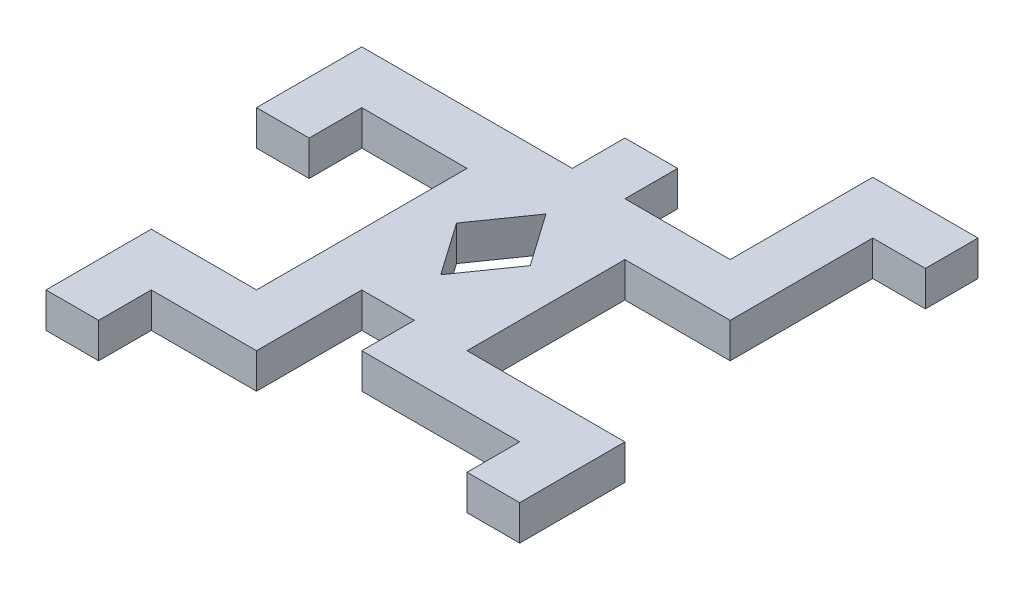
ISO-10303-21;
HEADER;
FILE_DESCRIPTION(('STEP AP214'),'2;1');
FILE_NAME('part.step','',(''),(''),'','','');
FILE_SCHEMA(('AUTOMOTIVE_DESIGN { 1 0 10303 214 1 1 1 1 }'));
ENDSEC;
DATA;
#1=APPLICATION_CONTEXT('core data for automotive mechanical design processes');
#2=APPLICATION_PROTOCOL_DEFINITION('international standard','automotive_design',2000,#1);
#3=PRODUCT_CONTEXT('',#1,'mechanical');
#4=PRODUCT('Part','Part','',(#3));
#5=PRODUCT_RELATED_PRODUCT_CATEGORY('part','',(#4));
#6=PRODUCT_DEFINITION_FORMATION('','',#4);
#7=PRODUCT_DEFINITION_CONTEXT('part definition',#1,'design');
#8=PRODUCT_DEFINITION('design','',#6,#7);
#9=PRODUCT_DEFINITION_SHAPE('','',#8);
#10=(LENGTH_UNIT() NAMED_UNIT(*) SI_UNIT(.MILLI.,.METRE.));
#11=(NAMED_UNIT(*) PLANE_ANGLE_UNIT() SI_UNIT($,.RADIAN.));
#12=(NAMED_UNIT(*) SI_UNIT($,.STERADIAN.) SOLID_ANGLE_UNIT());
#13=UNCERTAINTY_MEASURE_WITH_UNIT(LENGTH_MEASURE(1.E-05),#10,'distance_accuracy_value','');
#14=(GEOMETRIC_REPRESENTATION_CONTEXT(3) GLOBAL_UNCERTAINTY_ASSIGNED_CONTEXT((#13)) GLOBAL_UNIT_ASSIGNED_CONTEXT((#10,
#11,#12)) REPRESENTATION_CONTEXT('',''));
#15=CARTESIAN_POINT('',(0.,0.,0.));
#16=DIRECTION('',(0.,0.,1.));
#17=DIRECTION('',(1.,0.,0.));
#18=AXIS2_PLACEMENT_3D('',#15,#16,#17);
#19=CARTESIAN_POINT('',(-26.25,5.,0.));
#20=DIRECTION('',(-1.,0.,0.));
#21=DIRECTION('',(0.,0.,1.));
#22=AXIS2_PLACEMENT_3D('',#19,#20,#21);
#23=PLANE('',#22);
#24=DIRECTION('',(0.,0.,-1.));
#25=VECTOR('',#24,1.);
#26=CARTESIAN_POINT('',(-26.25,0.,0.));
#27=LINE('',#26,#25);
#28=CARTESIAN_POINT('',(-26.25,0.,0.));
#29=VERTEX_POINT('',#28);
#30=CARTESIAN_POINT('',(-26.25,0.,-7.5));
#31=VERTEX_POINT('',#30);
#32=EDGE_CURVE('E291',#29,#31,#27,.T.);
#33=ORIENTED_EDGE('',*,*,#32,.T.);
#34=DIRECTION('',(0.,-1.,0.));
#35=VECTOR('',#34,1.);
#36=CARTESIAN_POINT('',(-26.25,5.,-7.5));
#37=LINE('',#36,#35);
#38=CARTESIAN_POINT('',(-26.25,5.,-7.5));
#39=VERTEX_POINT('',#38);
#40=EDGE_CURVE('E11',#39,#31,#37,.T.);
#41=ORIENTED_EDGE('',*,*,#40,.F.);
#42=DIRECTION('',(0.,0.,-1.));
#43=VECTOR('',#42,1.);
#44=CARTESIAN_POINT('',(-26.25,5.,0.));
#45=LINE('',#44,#43);
#46=CARTESIAN_POINT('',(-26.25,5.,0.));
#47=VERTEX_POINT('',#46);
#48=EDGE_CURVE('E295',#47,#39,#45,.T.);
#49=ORIENTED_EDGE('',*,*,#48,.F.);
#50=DIRECTION('',(0.,-1.,0.));
#51=VECTOR('',#50,1.);
#52=CARTESIAN_POINT('',(-26.25,5.,0.));
#53=LINE('',#52,#51);
#54=EDGE_CURVE('E367',#47,#29,#53,.T.);
#55=ORIENTED_EDGE('',*,*,#54,.T.);
#56=EDGE_LOOP('',(#33,#41,#49,#55));
#57=FACE_BOUND('',#56,.T.);
#58=ADVANCED_FACE('F38',(#57),#23,.F.);
#59=CARTESIAN_POINT('',(0.,5.,-7.5));
#60=DIRECTION('',(0.,0.,-1.));
#61=DIRECTION('',(-1.,0.,0.));
#62=AXIS2_PLACEMENT_3D('',#59,#60,#61);
#63=PLANE('',#62);
#64=DIRECTION('',(1.,0.,0.));
#65=VECTOR('',#64,1.);
#66=CARTESIAN_POINT('',(0.,0.,-7.5));
#67=LINE('',#66,#65);
#68=CARTESIAN_POINT('',(-11.25,0.,-7.5));
#69=VERTEX_POINT('',#68);
#70=EDGE_CURVE('E370',#31,#69,#67,.T.);
#71=ORIENTED_EDGE('',*,*,#70,.T.);
#72=DIRECTION('',(0.,-1.,0.));
#73=VECTOR('',#72,1.);
#74=CARTESIAN_POINT('',(-11.25,5.,-7.5));
#75=LINE('',#74,#73);
#76=CARTESIAN_POINT('',(-11.25,5.,-7.5));
#77=VERTEX_POINT('',#76);
#78=EDGE_CURVE('E45',#77,#69,#75,.T.);
#79=ORIENTED_EDGE('',*,*,#78,.F.);
#80=DIRECTION('',(1.,0.,0.));
#81=VECTOR('',#80,1.);
#82=CARTESIAN_POINT('',(0.,5.,-7.5));
#83=LINE('',#82,#81);
#84=EDGE_CURVE('E298',#39,#77,#83,.T.);
#85=ORIENTED_EDGE('',*,*,#84,.F.);
#86=ORIENTED_EDGE('',*,*,#40,.T.);
#87=EDGE_LOOP('',(#71,#79,#85,#86));
#88=FACE_BOUND('',#87,.T.);
#89=ADVANCED_FACE('F535',(#88),#63,.F.);
#90=CARTESIAN_POINT('',(-11.25,5.,0.));
#91=DIRECTION('',(1.,0.,0.));
#92=DIRECTION('',(0.,0.,-1.));
#93=AXIS2_PLACEMENT_3D('',#90,#91,#92);
#94=PLANE('',#93);
#95=DIRECTION('',(0.,0.,1.));
#96=VECTOR('',#95,1.);
#97=CARTESIAN_POINT('',(-11.25,0.,0.));
#98=LINE('',#97,#96);
#99=CARTESIAN_POINT('',(-11.25,0.,22.5));
#100=VERTEX_POINT('',#99);
#101=EDGE_CURVE('E372',#69,#100,#98,.T.);
#102=ORIENTED_EDGE('',*,*,#101,.T.);
#103=DIRECTION('',(0.,-1.,0.));
#104=VECTOR('',#103,1.);
#105=CARTESIAN_POINT('',(-11.25,5.,22.5));
#106=LINE('',#105,#104);
#107=CARTESIAN_POINT('',(-11.25,5.,22.5));
#108=VERTEX_POINT('',#107);
#109=EDGE_CURVE('E507',#108,#100,#106,.T.);
#110=ORIENTED_EDGE('',*,*,#109,.F.);
#111=DIRECTION('',(0.,0.,1.));
#112=VECTOR('',#111,1.);
#113=CARTESIAN_POINT('',(-11.25,5.,0.));
#114=LINE('',#113,#112);
#115=EDGE_CURVE('E301',#77,#108,#114,.T.);
#116=ORIENTED_EDGE('',*,*,#115,.F.);
#117=ORIENTED_EDGE('',*,*,#78,.T.);
#118=EDGE_LOOP('',(#102,#110,#116,#117));
#119=FACE_BOUND('',#118,.T.);
#120=ADVANCED_FACE('F514',(#119),#94,.F.);
#121=CARTESIAN_POINT('',(0.,5.,22.5));
#122=DIRECTION('',(0.,0.,1.));
#123=DIRECTION('',(1.,0.,0.));
#124=AXIS2_PLACEMENT_3D('',#121,#122,#123);
#125=PLANE('',#124);
#126=DIRECTION('',(-1.,0.,0.));
#127=VECTOR('',#126,1.);
#128=CARTESIAN_POINT('',(0.,0.,22.5));
#129=LINE('',#128,#127);
#130=CARTESIAN_POINT('',(-26.25,0.,22.5));
#131=VERTEX_POINT('',#130);
#132=EDGE_CURVE('E374',#100,#131,#129,.T.);
#133=ORIENTED_EDGE('',*,*,#132,.T.);
#134=DIRECTION('',(0.,-1.,0.));
#135=VECTOR('',#134,1.);
#136=CARTESIAN_POINT('',(-26.25,5.,22.5));
#137=LINE('',#136,#135);
#138=CARTESIAN_POINT('',(-26.25,5.,22.5));
#139=VERTEX_POINT('',#138);
#140=EDGE_CURVE('E504',#139,#131,#137,.T.);
#141=ORIENTED_EDGE('',*,*,#140,.F.);
#142=DIRECTION('',(-1.,0.,0.));
#143=VECTOR('',#142,1.);
#144=CARTESIAN_POINT('',(0.,5.,22.5));
#145=LINE('',#144,#143);
#146=EDGE_CURVE('E303',#108,#139,#145,.T.);
#147=ORIENTED_EDGE('',*,*,#146,.F.);
#148=ORIENTED_EDGE('',*,*,#109,.T.);
#149=EDGE_LOOP('',(#133,#141,#147,#148));
#150=FACE_BOUND('',#149,.T.);
#151=ADVANCED_FACE('F523',(#150),#125,.F.);
#152=CARTESIAN_POINT('',(-26.25,5.,0.));
#153=DIRECTION('',(1.,0.,0.));
#154=DIRECTION('',(0.,0.,-1.));
#155=AXIS2_PLACEMENT_3D('',#152,#153,#154);
#156=PLANE('',#155);
#157=DIRECTION('',(0.,0.,1.));
#158=VECTOR('',#157,1.);
#159=CARTESIAN_POINT('',(-26.25,0.,0.));
#160=LINE('',#159,#158);
#161=CARTESIAN_POINT('',(-26.25,0.,37.5));
#162=VERTEX_POINT('',#161);
#163=EDGE_CURVE('E376',#131,#162,#160,.T.);
#164=ORIENTED_EDGE('',*,*,#163,.T.);
#165=DIRECTION('',(0.,-1.,0.));
#166=VECTOR('',#165,1.);
#167=CARTESIAN_POINT('',(-26.25,5.,37.5));
#168=LINE('',#167,#166);
#169=CARTESIAN_POINT('',(-26.25,5.,37.5));
#170=VERTEX_POINT('',#169);
#171=EDGE_CURVE('E501',#170,#162,#168,.T.);
#172=ORIENTED_EDGE('',*,*,#171,.F.);
#173=DIRECTION('',(0.,0.,1.));
#174=VECTOR('',#173,1.);
#175=CARTESIAN_POINT('',(-26.25,5.,0.));
#176=LINE('',#175,#174);
#177=EDGE_CURVE('E305',#139,#170,#176,.T.);
#178=ORIENTED_EDGE('',*,*,#177,.F.);
#179=ORIENTED_EDGE('',*,*,#140,.T.);
#180=EDGE_LOOP('',(#164,#172,#178,#179));
#181=FACE_BOUND('',#180,.T.);
#182=ADVANCED_FACE('F527',(#181),#156,.F.);
#183=CARTESIAN_POINT('',(0.,5.,37.5));
#184=DIRECTION('',(0.,0.,-1.));
#185=DIRECTION('',(-1.,0.,0.));
#186=AXIS2_PLACEMENT_3D('',#183,#184,#185);
#187=PLANE('',#186);
#188=DIRECTION('',(1.,0.,0.));
#189=VECTOR('',#188,1.);
#190=CARTESIAN_POINT('',(0.,0.,37.5));
#191=LINE('',#190,#189);
#192=CARTESIAN_POINT('',(-18.75,0.,37.5));
#193=VERTEX_POINT('',#192);
#194=EDGE_CURVE('E378',#162,#193,#191,.T.);
#195=ORIENTED_EDGE('',*,*,#194,.T.);
#196=DIRECTION('',(0.,-1.,0.));
#197=VECTOR('',#196,1.);
#198=CARTESIAN_POINT('',(-18.75,5.,37.5));
#199=LINE('',#198,#197);
#200=CARTESIAN_POINT('',(-18.75,5.,37.5));
#201=VERTEX_POINT('',#200);
#202=EDGE_CURVE('E498',#201,#193,#199,.T.);
#203=ORIENTED_EDGE('',*,*,#202,.F.);
#204=DIRECTION('',(1.,0.,0.));
#205=VECTOR('',#204,1.);
#206=CARTESIAN_POINT('',(0.,5.,37.5));
#207=LINE('',#206,#205);
#208=EDGE_CURVE('E307',#170,#201,#207,.T.);
#209=ORIENTED_EDGE('',*,*,#208,.F.);
#210=ORIENTED_EDGE('',*,*,#171,.T.);
#211=EDGE_LOOP('',(#195,#203,#209,#210));
#212=FACE_BOUND('',#211,.T.);
#213=ADVANCED_FACE('F647',(#212),#187,.F.);
#214=CARTESIAN_POINT('',(-18.75,5.,0.));
#215=DIRECTION('',(-1.,0.,0.));
#216=DIRECTION('',(0.,0.,1.));
#217=AXIS2_PLACEMENT_3D('',#214,#215,#216);
#218=PLANE('',#217);
#219=DIRECTION('',(0.,0.,-1.));
#220=VECTOR('',#219,1.);
#221=CARTESIAN_POINT('',(-18.75,0.,0.));
#222=LINE('',#221,#220);
#223=CARTESIAN_POINT('',(-18.75,0.,30.));
#224=VERTEX_POINT('',#223);
#225=EDGE_CURVE('E380',#193,#224,#222,.T.);
#226=ORIENTED_EDGE('',*,*,#225,.T.);
#227=DIRECTION('',(0.,-1.,0.));
#228=VECTOR('',#227,1.);
#229=CARTESIAN_POINT('',(-18.75,5.,30.));
#230=LINE('',#229,#228);
#231=CARTESIAN_POINT('',(-18.75,5.,30.));
#232=VERTEX_POINT('',#231);
#233=EDGE_CURVE('E495',#232,#224,#230,.T.);
#234=ORIENTED_EDGE('',*,*,#233,.F.);
#235=DIRECTION('',(0.,0.,-1.));
#236=VECTOR('',#235,1.);
#237=CARTESIAN_POINT('',(-18.75,5.,0.));
#238=LINE('',#237,#236);
#239=EDGE_CURVE('E309',#201,#232,#238,.T.);
#240=ORIENTED_EDGE('',*,*,#239,.F.);
#241=ORIENTED_EDGE('',*,*,#202,.T.);
#242=EDGE_LOOP('',(#226,#234,#240,#241));
#243=FACE_BOUND('',#242,.T.);
#244=ADVANCED_FACE('F644',(#243),#218,.F.);
#245=CARTESIAN_POINT('',(0.,5.,30.));
#246=DIRECTION('',(0.,0.,-1.));
#247=DIRECTION('',(-1.,0.,0.));
#248=AXIS2_PLACEMENT_3D('',#245,#246,#247);
#249=PLANE('',#248);
#250=DIRECTION('',(1.,0.,0.));
#251=VECTOR('',#250,1.);
#252=CARTESIAN_POINT('',(0.,0.,30.));
#253=LINE('',#252,#251);
#254=CARTESIAN_POINT('',(-3.74999999999999,0.,30.));
#255=VERTEX_POINT('',#254);
#256=EDGE_CURVE('E382',#224,#255,#253,.T.);
#257=ORIENTED_EDGE('',*,*,#256,.T.);
#258=DIRECTION('',(0.,-1.,0.));
#259=VECTOR('',#258,1.);
#260=CARTESIAN_POINT('',(-3.74999999999999,5.,30.));
#261=LINE('',#260,#259);
#262=CARTESIAN_POINT('',(-3.74999999999999,5.,30.));
#263=VERTEX_POINT('',#262);
#264=EDGE_CURVE('E492',#263,#255,#261,.T.);
#265=ORIENTED_EDGE('',*,*,#264,.F.);
#266=DIRECTION('',(1.,0.,0.));
#267=VECTOR('',#266,1.);
#268=CARTESIAN_POINT('',(0.,5.,30.));
#269=LINE('',#268,#267);
#270=EDGE_CURVE('E311',#232,#263,#269,.T.);
#271=ORIENTED_EDGE('',*,*,#270,.F.);
#272=ORIENTED_EDGE('',*,*,#233,.T.);
#273=EDGE_LOOP('',(#257,#265,#271,#272));
#274=FACE_BOUND('',#273,.T.);
#275=ADVANCED_FACE('F640',(#274),#249,.F.);
#276=CARTESIAN_POINT('',(-3.74999999999999,5.,0.));
#277=DIRECTION('',(-1.,0.,0.));
#278=DIRECTION('',(0.,0.,1.));
#279=AXIS2_PLACEMENT_3D('',#276,#277,#278);
#280=PLANE('',#279);
#281=DIRECTION('',(0.,0.,-1.));
#282=VECTOR('',#281,1.);
#283=CARTESIAN_POINT('',(-3.74999999999999,0.,0.));
#284=LINE('',#283,#282);
#285=CARTESIAN_POINT('',(-3.74999999999999,0.,15.));
#286=VERTEX_POINT('',#285);
#287=EDGE_CURVE('E384',#255,#286,#284,.T.);
#288=ORIENTED_EDGE('',*,*,#287,.T.);
#289=DIRECTION('',(0.,-1.,0.));
#290=VECTOR('',#289,1.);
#291=CARTESIAN_POINT('',(-3.74999999999999,5.,15.));
#292=LINE('',#291,#290);
#293=CARTESIAN_POINT('',(-3.74999999999999,5.,15.));
#294=VERTEX_POINT('',#293);
#295=EDGE_CURVE('E489',#294,#286,#292,.T.);
#296=ORIENTED_EDGE('',*,*,#295,.F.);
#297=DIRECTION('',(0.,0.,-1.));
#298=VECTOR('',#297,1.);
#299=CARTESIAN_POINT('',(-3.74999999999999,5.,0.));
#300=LINE('',#299,#298);
#301=EDGE_CURVE('E313',#263,#294,#300,.T.);
#302=ORIENTED_EDGE('',*,*,#301,.F.);
#303=ORIENTED_EDGE('',*,*,#264,.T.);
#304=EDGE_LOOP('',(#288,#296,#302,#303));
#305=FACE_BOUND('',#304,.T.);
#306=ADVANCED_FACE('F636',(#305),#280,.F.);
#307=CARTESIAN_POINT('',(0.,5.,15.));
#308=DIRECTION('',(0.,0.,-1.));
#309=DIRECTION('',(-1.,0.,0.));
#310=AXIS2_PLACEMENT_3D('',#307,#308,#309);
#311=PLANE('',#310);
#312=DIRECTION('',(1.,0.,0.));
#313=VECTOR('',#312,1.);
#314=CARTESIAN_POINT('',(0.,0.,15.));
#315=LINE('',#314,#313);
#316=CARTESIAN_POINT('',(3.75000000000001,0.,15.));
#317=VERTEX_POINT('',#316);
#318=EDGE_CURVE('E386',#286,#317,#315,.T.);
#319=ORIENTED_EDGE('',*,*,#318,.T.);
#320=DIRECTION('',(0.,-1.,0.));
#321=VECTOR('',#320,1.);
#322=CARTESIAN_POINT('',(3.75000000000001,5.,15.));
#323=LINE('',#322,#321);
#324=CARTESIAN_POINT('',(3.75000000000001,5.,15.));
#325=VERTEX_POINT('',#324);
#326=EDGE_CURVE('E486',#325,#317,#323,.T.);
#327=ORIENTED_EDGE('',*,*,#326,.F.);
#328=DIRECTION('',(1.,0.,0.));
#329=VECTOR('',#328,1.);
#330=CARTESIAN_POINT('',(0.,5.,15.));
#331=LINE('',#330,#329);
#332=EDGE_CURVE('E315',#294,#325,#331,.T.);
#333=ORIENTED_EDGE('',*,*,#332,.F.);
#334=ORIENTED_EDGE('',*,*,#295,.T.);
#335=EDGE_LOOP('',(#319,#327,#333,#334));
#336=FACE_BOUND('',#335,.T.);
#337=ADVANCED_FACE('F631',(#336),#311,.F.);
#338=CARTESIAN_POINT('',(3.75,5.,0.));
#339=DIRECTION('',(1.,0.,0.));
#340=DIRECTION('',(0.,0.,-1.));
#341=AXIS2_PLACEMENT_3D('',#338,#339,#340);
#342=PLANE('',#341);
#343=DIRECTION('',(0.,0.,1.));
#344=VECTOR('',#343,1.);
#345=CARTESIAN_POINT('',(3.75,0.,0.));
#346=LINE('',#345,#344);
#347=CARTESIAN_POINT('',(3.75000000000001,0.,22.5));
#348=VERTEX_POINT('',#347);
#349=EDGE_CURVE('E388',#317,#348,#346,.T.);
#350=ORIENTED_EDGE('',*,*,#349,.T.);
#351=DIRECTION('',(0.,-1.,0.));
#352=VECTOR('',#351,1.);
#353=CARTESIAN_POINT('',(3.75000000000001,5.,22.5));
#354=LINE('',#353,#352);
#355=CARTESIAN_POINT('',(3.75000000000001,5.,22.5));
#356=VERTEX_POINT('',#355);
#357=EDGE_CURVE('E483',#356,#348,#354,.T.);
#358=ORIENTED_EDGE('',*,*,#357,.F.);
#359=DIRECTION('',(0.,0.,1.));
#360=VECTOR('',#359,1.);
#361=CARTESIAN_POINT('',(3.75,5.,0.));
#362=LINE('',#361,#360);
#363=EDGE_CURVE('E317',#325,#356,#362,.T.);
#364=ORIENTED_EDGE('',*,*,#363,.F.);
#365=ORIENTED_EDGE('',*,*,#326,.T.);
#366=EDGE_LOOP('',(#350,#358,#364,#365));
#367=FACE_BOUND('',#366,.T.);
#368=ADVANCED_FACE('F625',(#367),#342,.F.);
#369=CARTESIAN_POINT('',(0.,5.,22.5));
#370=DIRECTION('',(0.,0.,-1.));
#371=DIRECTION('',(-1.,0.,0.));
#372=AXIS2_PLACEMENT_3D('',#369,#370,#371);
#373=PLANE('',#372);
#374=DIRECTION('',(1.,0.,0.));
#375=VECTOR('',#374,1.);
#376=CARTESIAN_POINT('',(0.,0.,22.5));
#377=LINE('',#376,#375);
#378=CARTESIAN_POINT('',(26.25,0.,22.5));
#379=VERTEX_POINT('',#378);
#380=EDGE_CURVE('E390',#348,#379,#377,.T.);
#381=ORIENTED_EDGE('',*,*,#380,.T.);
#382=DIRECTION('',(0.,-1.,0.));
#383=VECTOR('',#382,1.);
#384=CARTESIAN_POINT('',(26.25,5.,22.5));
#385=LINE('',#384,#383);
#386=CARTESIAN_POINT('',(26.25,5.,22.5));
#387=VERTEX_POINT('',#386);
#388=EDGE_CURVE('E480',#387,#379,#385,.T.);
#389=ORIENTED_EDGE('',*,*,#388,.F.);
#390=DIRECTION('',(1.,0.,0.));
#391=VECTOR('',#390,1.);
#392=CARTESIAN_POINT('',(0.,5.,22.5));
#393=LINE('',#392,#391);
#394=EDGE_CURVE('E319',#356,#387,#393,.T.);
#395=ORIENTED_EDGE('',*,*,#394,.F.);
#396=ORIENTED_EDGE('',*,*,#357,.T.);
#397=EDGE_LOOP('',(#381,#389,#395,#396));
#398=FACE_BOUND('',#397,.T.);
#399=ADVANCED_FACE('F621',(#398),#373,.F.);
#400=CARTESIAN_POINT('',(26.25,5.,0.));
#401=DIRECTION('',(1.,0.,0.));
#402=DIRECTION('',(0.,0.,-1.));
#403=AXIS2_PLACEMENT_3D('',#400,#401,#402);
#404=PLANE('',#403);
#405=DIRECTION('',(0.,0.,1.));
#406=VECTOR('',#405,1.);
#407=CARTESIAN_POINT('',(26.25,0.,0.));
#408=LINE('',#407,#406);
#409=CARTESIAN_POINT('',(26.25,0.,30.));
#410=VERTEX_POINT('',#409);
#411=EDGE_CURVE('E392',#379,#410,#408,.T.);
#412=ORIENTED_EDGE('',*,*,#411,.T.);
#413=DIRECTION('',(0.,-1.,0.));
#414=VECTOR('',#413,1.);
#415=CARTESIAN_POINT('',(26.25,5.,30.));
#416=LINE('',#415,#414);
#417=CARTESIAN_POINT('',(26.25,5.,30.));
#418=VERTEX_POINT('',#417);
#419=EDGE_CURVE('E477',#418,#410,#416,.T.);
#420=ORIENTED_EDGE('',*,*,#419,.F.);
#421=DIRECTION('',(0.,0.,1.));
#422=VECTOR('',#421,1.);
#423=CARTESIAN_POINT('',(26.25,5.,0.));
#424=LINE('',#423,#422);
#425=EDGE_CURVE('E321',#387,#418,#424,.T.);
#426=ORIENTED_EDGE('',*,*,#425,.F.);
#427=ORIENTED_EDGE('',*,*,#388,.T.);
#428=EDGE_LOOP('',(#412,#420,#426,#427));
#429=FACE_BOUND('',#428,.T.);
#430=ADVANCED_FACE('F616',(#429),#404,.F.);
#431=CARTESIAN_POINT('',(0.,5.,30.));
#432=DIRECTION('',(0.,0.,-1.));
#433=DIRECTION('',(-1.,0.,0.));
#434=AXIS2_PLACEMENT_3D('',#431,#432,#433);
#435=PLANE('',#434);
#436=DIRECTION('',(1.,0.,0.));
#437=VECTOR('',#436,1.);
#438=CARTESIAN_POINT('',(0.,0.,30.));
#439=LINE('',#438,#437);
#440=CARTESIAN_POINT('',(33.75,0.,30.));
#441=VERTEX_POINT('',#440);
#442=EDGE_CURVE('E394',#410,#441,#439,.T.);
#443=ORIENTED_EDGE('',*,*,#442,.T.);
#444=DIRECTION('',(0.,-1.,0.));
#445=VECTOR('',#444,1.);
#446=CARTESIAN_POINT('',(33.75,5.,30.));
#447=LINE('',#446,#445);
#448=CARTESIAN_POINT('',(33.75,5.,30.));
#449=VERTEX_POINT('',#448);
#450=EDGE_CURVE('E474',#449,#441,#447,.T.);
#451=ORIENTED_EDGE('',*,*,#450,.F.);
#452=DIRECTION('',(1.,0.,0.));
#453=VECTOR('',#452,1.);
#454=CARTESIAN_POINT('',(0.,5.,30.));
#455=LINE('',#454,#453);
#456=EDGE_CURVE('E323',#418,#449,#455,.T.);
#457=ORIENTED_EDGE('',*,*,#456,.F.);
#458=ORIENTED_EDGE('',*,*,#419,.T.);
#459=EDGE_LOOP('',(#443,#451,#457,#458));
#460=FACE_BOUND('',#459,.T.);
#461=ADVANCED_FACE('F610',(#460),#435,.F.);
#462=CARTESIAN_POINT('',(33.75,5.,0.));
#463=DIRECTION('',(-1.,0.,0.));
#464=DIRECTION('',(0.,0.,1.));
#465=AXIS2_PLACEMENT_3D('',#462,#463,#464);
#466=PLANE('',#465);
#467=DIRECTION('',(0.,0.,-1.));
#468=VECTOR('',#467,1.);
#469=CARTESIAN_POINT('',(33.75,0.,0.));
#470=LINE('',#469,#468);
#471=CARTESIAN_POINT('',(33.75,0.,15.));
#472=VERTEX_POINT('',#471);
#473=EDGE_CURVE('E396',#441,#472,#470,.T.);
#474=ORIENTED_EDGE('',*,*,#473,.T.);
#475=DIRECTION('',(0.,-1.,0.));
#476=VECTOR('',#475,1.);
#477=CARTESIAN_POINT('',(33.75,5.,15.));
#478=LINE('',#477,#476);
#479=CARTESIAN_POINT('',(33.75,5.,15.));
#480=VERTEX_POINT('',#479);
#481=EDGE_CURVE('E471',#480,#472,#478,.T.);
#482=ORIENTED_EDGE('',*,*,#481,.F.);
#483=DIRECTION('',(0.,0.,-1.));
#484=VECTOR('',#483,1.);
#485=CARTESIAN_POINT('',(33.75,5.,0.));
#486=LINE('',#485,#484);
#487=EDGE_CURVE('E325',#449,#480,#486,.T.);
#488=ORIENTED_EDGE('',*,*,#487,.F.);
#489=ORIENTED_EDGE('',*,*,#450,.T.);
#490=EDGE_LOOP('',(#474,#482,#488,#489));
#491=FACE_BOUND('',#490,.T.);
#492=ADVANCED_FACE('F606',(#491),#466,.F.);
#493=CARTESIAN_POINT('',(0.,5.,15.));
#494=DIRECTION('',(0.,0.,1.));
#495=DIRECTION('',(1.,0.,0.));
#496=AXIS2_PLACEMENT_3D('',#493,#494,#495);
#497=PLANE('',#496);
#498=DIRECTION('',(-1.,0.,0.));
#499=VECTOR('',#498,1.);
#500=CARTESIAN_POINT('',(0.,0.,15.));
#501=LINE('',#500,#499);
#502=CARTESIAN_POINT('',(11.25,0.,15.));
#503=VERTEX_POINT('',#502);
#504=EDGE_CURVE('E398',#472,#503,#501,.T.);
#505=ORIENTED_EDGE('',*,*,#504,.T.);
#506=DIRECTION('',(0.,-1.,0.));
#507=VECTOR('',#506,1.);
#508=CARTESIAN_POINT('',(11.25,5.,15.));
#509=LINE('',#508,#507);
#510=CARTESIAN_POINT('',(11.25,5.,15.));
#511=VERTEX_POINT('',#510);
#512=EDGE_CURVE('E469',#511,#503,#509,.T.);
#513=ORIENTED_EDGE('',*,*,#512,.F.);
#514=DIRECTION('',(-1.,0.,0.));
#515=VECTOR('',#514,1.);
#516=CARTESIAN_POINT('',(0.,5.,15.));
#517=LINE('',#516,#515);
#518=EDGE_CURVE('E327',#480,#511,#517,.T.);
#519=ORIENTED_EDGE('',*,*,#518,.F.);
#520=ORIENTED_EDGE('',*,*,#481,.T.);
#521=EDGE_LOOP('',(#505,#513,#519,#520));
#522=FACE_BOUND('',#521,.T.);
#523=ADVANCED_FACE('F601',(#522),#497,.F.);
#524=CARTESIAN_POINT('',(11.25,5.,0.));
#525=DIRECTION('',(1.,0.,0.));
#526=DIRECTION('',(0.,0.,-1.));
#527=AXIS2_PLACEMENT_3D('',#524,#525,#526);
#528=PLANE('',#527);
#529=DIRECTION('',(0.,0.,1.));
#530=VECTOR('',#529,1.);
#531=CARTESIAN_POINT('',(11.25,0.,0.));
#532=LINE('',#531,#530);
#533=CARTESIAN_POINT('',(11.25,0.,-7.5));
#534=VERTEX_POINT('',#533);
#535=EDGE_CURVE('E401',#534,#503,#532,.T.);
#536=ORIENTED_EDGE('',*,*,#535,.F.);
#537=DIRECTION('',(0.,-1.,0.));
#538=VECTOR('',#537,1.);
#539=CARTESIAN_POINT('',(11.25,5.,-7.5));
#540=LINE('',#539,#538);
#541=CARTESIAN_POINT('',(11.25,5.,-7.5));
#542=VERTEX_POINT('',#541);
#543=EDGE_CURVE('E467',#542,#534,#540,.T.);
#544=ORIENTED_EDGE('',*,*,#543,.F.);
#545=DIRECTION('',(0.,0.,1.));
#546=VECTOR('',#545,1.);
#547=CARTESIAN_POINT('',(11.25,5.,0.));
#548=LINE('',#547,#546);
#549=EDGE_CURVE('E329',#542,#511,#548,.T.);
#550=ORIENTED_EDGE('',*,*,#549,.T.);
#551=ORIENTED_EDGE('',*,*,#512,.T.);
#552=EDGE_LOOP('',(#536,#544,#550,#551));
#553=FACE_BOUND('',#552,.T.);
#554=ADVANCED_FACE('F595',(#553),#528,.T.);
#555=CARTESIAN_POINT('',(0.,5.,-7.5));
#556=DIRECTION('',(0.,0.,1.));
#557=DIRECTION('',(1.,0.,0.));
#558=AXIS2_PLACEMENT_3D('',#555,#556,#557);
#559=PLANE('',#558);
#560=DIRECTION('',(-1.,0.,0.));
#561=VECTOR('',#560,1.);
#562=CARTESIAN_POINT('',(0.,0.,-7.5));
#563=LINE('',#562,#561);
#564=CARTESIAN_POINT('',(26.25,0.,-7.5));
#565=VERTEX_POINT('',#564);
#566=EDGE_CURVE('E404',#565,#534,#563,.T.);
#567=ORIENTED_EDGE('',*,*,#566,.F.);
#568=DIRECTION('',(0.,-1.,0.));
#569=VECTOR('',#568,1.);
#570=CARTESIAN_POINT('',(26.25,5.,-7.5));
#571=LINE('',#570,#569);
#572=CARTESIAN_POINT('',(26.25,5.,-7.5));
#573=VERTEX_POINT('',#572);
#574=EDGE_CURVE('E465',#573,#565,#571,.T.);
#575=ORIENTED_EDGE('',*,*,#574,.F.);
#576=DIRECTION('',(-1.,0.,0.));
#577=VECTOR('',#576,1.);
#578=CARTESIAN_POINT('',(0.,5.,-7.5));
#579=LINE('',#578,#577);
#580=EDGE_CURVE('E332',#573,#542,#579,.T.);
#581=ORIENTED_EDGE('',*,*,#580,.T.);
#582=ORIENTED_EDGE('',*,*,#543,.T.);
#583=EDGE_LOOP('',(#567,#575,#581,#582));
#584=FACE_BOUND('',#583,.T.);
#585=ADVANCED_FACE('F591',(#584),#559,.T.);
#586=CARTESIAN_POINT('',(26.25,5.,0.));
#587=DIRECTION('',(1.,0.,0.));
#588=DIRECTION('',(0.,0.,-1.));
#589=AXIS2_PLACEMENT_3D('',#586,#587,#588);
#590=PLANE('',#589);
#591=DIRECTION('',(0.,0.,1.));
#592=VECTOR('',#591,1.);
#593=CARTESIAN_POINT('',(26.25,0.,0.));
#594=LINE('',#593,#592);
#595=CARTESIAN_POINT('',(26.25,0.,-27.8131635977066));
#596=VERTEX_POINT('',#595);
#597=EDGE_CURVE('E407',#596,#565,#594,.T.);
#598=ORIENTED_EDGE('',*,*,#597,.F.);
#599=DIRECTION('',(0.,-1.,0.));
#600=VECTOR('',#599,1.);
#601=CARTESIAN_POINT('',(26.25,5.,-27.8131635977066));
#602=LINE('',#601,#600);
#603=CARTESIAN_POINT('',(26.25,5.,-27.8131635977066));
#604=VERTEX_POINT('',#603);
#605=EDGE_CURVE('E463',#604,#596,#602,.T.);
#606=ORIENTED_EDGE('',*,*,#605,.F.);
#607=DIRECTION('',(0.,0.,1.));
#608=VECTOR('',#607,1.);
#609=CARTESIAN_POINT('',(26.25,5.,0.));
#610=LINE('',#609,#608);
#611=EDGE_CURVE('E335',#604,#573,#610,.T.);
#612=ORIENTED_EDGE('',*,*,#611,.T.);
#613=ORIENTED_EDGE('',*,*,#574,.T.);
#614=EDGE_LOOP('',(#598,#606,#612,#613));
#615=FACE_BOUND('',#614,.T.);
#616=ADVANCED_FACE('F587',(#615),#590,.T.);
#617=CARTESIAN_POINT('',(0.,5.,-27.8131635977066));
#618=DIRECTION('',(0.,0.,1.));
#619=DIRECTION('',(1.,0.,0.));
#620=AXIS2_PLACEMENT_3D('',#617,#618,#619);
#621=PLANE('',#620);
#622=DIRECTION('',(-1.,0.,0.));
#623=VECTOR('',#622,1.);
#624=CARTESIAN_POINT('',(0.,0.,-27.8131635977066));
#625=LINE('',#624,#623);
#626=CARTESIAN_POINT('',(33.75,0.,-27.8131635977066));
#627=VERTEX_POINT('',#626);
#628=EDGE_CURVE('E410',#627,#596,#625,.T.);
#629=ORIENTED_EDGE('',*,*,#628,.F.);
#630=DIRECTION('',(0.,-1.,0.));
#631=VECTOR('',#630,1.);
#632=CARTESIAN_POINT('',(33.75,5.,-27.8131635977066));
#633=LINE('',#632,#631);
#634=CARTESIAN_POINT('',(33.75,5.,-27.8131635977066));
#635=VERTEX_POINT('',#634);
#636=EDGE_CURVE('E461',#635,#627,#633,.T.);
#637=ORIENTED_EDGE('',*,*,#636,.F.);
#638=DIRECTION('',(-1.,0.,0.));
#639=VECTOR('',#638,1.);
#640=CARTESIAN_POINT('',(0.,5.,-27.8131635977066));
#641=LINE('',#640,#639);
#642=EDGE_CURVE('E338',#635,#604,#641,.T.);
#643=ORIENTED_EDGE('',*,*,#642,.T.);
#644=ORIENTED_EDGE('',*,*,#605,.T.);
#645=EDGE_LOOP('',(#629,#637,#643,#644));
#646=FACE_BOUND('',#645,.T.);
#647=ADVANCED_FACE('F583',(#646),#621,.T.);
#648=CARTESIAN_POINT('',(33.75,5.,0.));
#649=DIRECTION('',(1.,0.,0.));
#650=DIRECTION('',(0.,0.,-1.));
#651=AXIS2_PLACEMENT_3D('',#648,#649,#650);
#652=PLANE('',#651);
#653=DIRECTION('',(0.,0.,1.));
#654=VECTOR('',#653,1.);
#655=CARTESIAN_POINT('',(33.75,0.,0.));
#656=LINE('',#655,#654);
#657=CARTESIAN_POINT('',(33.75,0.,-35.3131635977066));
#658=VERTEX_POINT('',#657);
#659=EDGE_CURVE('E413',#658,#627,#656,.T.);
#660=ORIENTED_EDGE('',*,*,#659,.F.);
#661=DIRECTION('',(0.,-1.,0.));
#662=VECTOR('',#661,1.);
#663=CARTESIAN_POINT('',(33.75,5.,-35.3131635977066));
#664=LINE('',#663,#662);
#665=CARTESIAN_POINT('',(33.75,5.,-35.3131635977066));
#666=VERTEX_POINT('',#665);
#667=EDGE_CURVE('E459',#666,#658,#664,.T.);
#668=ORIENTED_EDGE('',*,*,#667,.F.);
#669=DIRECTION('',(0.,0.,1.));
#670=VECTOR('',#669,1.);
#671=CARTESIAN_POINT('',(33.75,5.,0.));
#672=LINE('',#671,#670);
#673=EDGE_CURVE('E341',#666,#635,#672,.T.);
#674=ORIENTED_EDGE('',*,*,#673,.T.);
#675=ORIENTED_EDGE('',*,*,#636,.T.);
#676=EDGE_LOOP('',(#660,#668,#674,#675));
#677=FACE_BOUND('',#676,.T.);
#678=ADVANCED_FACE('F579',(#677),#652,.T.);
#679=CARTESIAN_POINT('',(0.,5.,-35.3131635977066));
#680=DIRECTION('',(0.,0.,-1.));
#681=DIRECTION('',(-1.,0.,0.));
#682=AXIS2_PLACEMENT_3D('',#679,#680,#681);
#683=PLANE('',#682);
#684=DIRECTION('',(1.,0.,0.));
#685=VECTOR('',#684,1.);
#686=CARTESIAN_POINT('',(0.,0.,-35.3131635977066));
#687=LINE('',#686,#685);
#688=CARTESIAN_POINT('',(18.75,0.,-35.3131635977066));
#689=VERTEX_POINT('',#688);
#690=EDGE_CURVE('E416',#689,#658,#687,.T.);
#691=ORIENTED_EDGE('',*,*,#690,.F.);
#692=DIRECTION('',(0.,-1.,0.));
#693=VECTOR('',#692,1.);
#694=CARTESIAN_POINT('',(18.75,5.,-35.3131635977066));
#695=LINE('',#694,#693);
#696=CARTESIAN_POINT('',(18.75,5.,-35.3131635977066));
#697=VERTEX_POINT('',#696);
#698=EDGE_CURVE('E457',#697,#689,#695,.T.);
#699=ORIENTED_EDGE('',*,*,#698,.F.);
#700=DIRECTION('',(1.,0.,0.));
#701=VECTOR('',#700,1.);
#702=CARTESIAN_POINT('',(0.,5.,-35.3131635977066));
#703=LINE('',#702,#701);
#704=EDGE_CURVE('E344',#697,#666,#703,.T.);
#705=ORIENTED_EDGE('',*,*,#704,.T.);
#706=ORIENTED_EDGE('',*,*,#667,.T.);
#707=EDGE_LOOP('',(#691,#699,#705,#706));
#708=FACE_BOUND('',#707,.T.);
#709=ADVANCED_FACE('F575',(#708),#683,.T.);
#710=CARTESIAN_POINT('',(18.75,5.,0.));
#711=DIRECTION('',(-1.,0.,0.));
#712=DIRECTION('',(0.,0.,1.));
#713=AXIS2_PLACEMENT_3D('',#710,#711,#712);
#714=PLANE('',#713);
#715=DIRECTION('',(0.,0.,-1.));
#716=VECTOR('',#715,1.);
#717=CARTESIAN_POINT('',(18.75,0.,0.));
#718=LINE('',#717,#716);
#719=CARTESIAN_POINT('',(18.75,0.,-15.));
#720=VERTEX_POINT('',#719);
#721=EDGE_CURVE('E419',#720,#689,#718,.T.);
#722=ORIENTED_EDGE('',*,*,#721,.F.);
#723=DIRECTION('',(0.,-1.,0.));
#724=VECTOR('',#723,1.);
#725=CARTESIAN_POINT('',(18.75,5.,-15.));
#726=LINE('',#725,#724);
#727=CARTESIAN_POINT('',(18.75,5.,-15.));
#728=VERTEX_POINT('',#727);
#729=EDGE_CURVE('E455',#728,#720,#726,.T.);
#730=ORIENTED_EDGE('',*,*,#729,.F.);
#731=DIRECTION('',(0.,0.,-1.));
#732=VECTOR('',#731,1.);
#733=CARTESIAN_POINT('',(18.75,5.,0.));
#734=LINE('',#733,#732);
#735=EDGE_CURVE('E347',#728,#697,#734,.T.);
#736=ORIENTED_EDGE('',*,*,#735,.T.);
#737=ORIENTED_EDGE('',*,*,#698,.T.);
#738=EDGE_LOOP('',(#722,#730,#736,#737));
#739=FACE_BOUND('',#738,.T.);
#740=ADVANCED_FACE('F571',(#739),#714,.T.);
#741=CARTESIAN_POINT('',(0.,5.,-15.));
#742=DIRECTION('',(0.,0.,-1.));
#743=DIRECTION('',(-1.,0.,0.));
#744=AXIS2_PLACEMENT_3D('',#741,#742,#743);
#745=PLANE('',#744);
#746=DIRECTION('',(1.,0.,0.));
#747=VECTOR('',#746,1.);
#748=CARTESIAN_POINT('',(0.,0.,-15.));
#749=LINE('',#748,#747);
#750=CARTESIAN_POINT('',(3.75,0.,-15.));
#751=VERTEX_POINT('',#750);
#752=EDGE_CURVE('E422',#751,#720,#749,.T.);
#753=ORIENTED_EDGE('',*,*,#752,.F.);
#754=DIRECTION('',(0.,-1.,0.));
#755=VECTOR('',#754,1.);
#756=CARTESIAN_POINT('',(3.75,5.,-15.));
#757=LINE('',#756,#755);
#758=CARTESIAN_POINT('',(3.75,5.,-15.));
#759=VERTEX_POINT('',#758);
#760=EDGE_CURVE('E453',#759,#751,#757,.T.);
#761=ORIENTED_EDGE('',*,*,#760,.F.);
#762=DIRECTION('',(1.,0.,0.));
#763=VECTOR('',#762,1.);
#764=CARTESIAN_POINT('',(0.,5.,-15.));
#765=LINE('',#764,#763);
#766=EDGE_CURVE('E350',#759,#728,#765,.T.);
#767=ORIENTED_EDGE('',*,*,#766,.T.);
#768=ORIENTED_EDGE('',*,*,#729,.T.);
#769=EDGE_LOOP('',(#753,#761,#767,#768));
#770=FACE_BOUND('',#769,.T.);
#771=ADVANCED_FACE('F565',(#770),#745,.T.);
#772=CARTESIAN_POINT('',(3.75,5.,0.));
#773=DIRECTION('',(-1.,0.,0.));
#774=DIRECTION('',(0.,0.,1.));
#775=AXIS2_PLACEMENT_3D('',#772,#773,#774);
#776=PLANE('',#775);
#777=DIRECTION('',(0.,0.,-1.));
#778=VECTOR('',#777,1.);
#779=CARTESIAN_POINT('',(3.75,0.,0.));
#780=LINE('',#779,#778);
#781=CARTESIAN_POINT('',(3.75,0.,-22.5));
#782=VERTEX_POINT('',#781);
#783=EDGE_CURVE('E425',#751,#782,#780,.T.);
#784=ORIENTED_EDGE('',*,*,#783,.T.);
#785=DIRECTION('',(0.,-1.,0.));
#786=VECTOR('',#785,1.);
#787=CARTESIAN_POINT('',(3.75,5.,-22.5));
#788=LINE('',#787,#786);
#789=CARTESIAN_POINT('',(3.75,5.,-22.5));
#790=VERTEX_POINT('',#789);
#791=EDGE_CURVE('E451',#790,#782,#788,.T.);
#792=ORIENTED_EDGE('',*,*,#791,.F.);
#793=DIRECTION('',(0.,0.,-1.));
#794=VECTOR('',#793,1.);
#795=CARTESIAN_POINT('',(3.75,5.,0.));
#796=LINE('',#795,#794);
#797=EDGE_CURVE('E353',#759,#790,#796,.T.);
#798=ORIENTED_EDGE('',*,*,#797,.F.);
#799=ORIENTED_EDGE('',*,*,#760,.T.);
#800=EDGE_LOOP('',(#784,#792,#798,#799));
#801=FACE_BOUND('',#800,.T.);
#802=ADVANCED_FACE('F824',(#801),#776,.F.);
#803=CARTESIAN_POINT('',(0.,5.,-22.5));
#804=DIRECTION('',(0.,0.,-1.));
#805=DIRECTION('',(-1.,0.,0.));
#806=AXIS2_PLACEMENT_3D('',#803,#804,#805);
#807=PLANE('',#806);
#808=DIRECTION('',(1.,0.,0.));
#809=VECTOR('',#808,1.);
#810=CARTESIAN_POINT('',(0.,0.,-22.5));
#811=LINE('',#810,#809);
#812=CARTESIAN_POINT('',(-3.75,0.,-22.5));
#813=VERTEX_POINT('',#812);
#814=EDGE_CURVE('E428',#813,#782,#811,.T.);
#815=ORIENTED_EDGE('',*,*,#814,.F.);
#816=DIRECTION('',(0.,-1.,0.));
#817=VECTOR('',#816,1.);
#818=CARTESIAN_POINT('',(-3.75,5.,-22.5));
#819=LINE('',#818,#817);
#820=CARTESIAN_POINT('',(-3.75,5.,-22.5));
#821=VERTEX_POINT('',#820);
#822=EDGE_CURVE('E449',#821,#813,#819,.T.);
#823=ORIENTED_EDGE('',*,*,#822,.F.);
#824=DIRECTION('',(1.,0.,0.));
#825=VECTOR('',#824,1.);
#826=CARTESIAN_POINT('',(0.,5.,-22.5));
#827=LINE('',#826,#825);
#828=EDGE_CURVE('E355',#821,#790,#827,.T.);
#829=ORIENTED_EDGE('',*,*,#828,.T.);
#830=ORIENTED_EDGE('',*,*,#791,.T.);
#831=EDGE_LOOP('',(#815,#823,#829,#830));
#832=FACE_BOUND('',#831,.T.);
#833=ADVANCED_FACE('F559',(#832),#807,.T.);
#834=CARTESIAN_POINT('',(-3.75,5.,0.));
#835=DIRECTION('',(-1.,0.,0.));
#836=DIRECTION('',(0.,0.,1.));
#837=AXIS2_PLACEMENT_3D('',#834,#835,#836);
#838=PLANE('',#837);
#839=DIRECTION('',(0.,0.,-1.));
#840=VECTOR('',#839,1.);
#841=CARTESIAN_POINT('',(-3.75,0.,0.));
#842=LINE('',#841,#840);
#843=CARTESIAN_POINT('',(-3.75,0.,-15.));
#844=VERTEX_POINT('',#843);
#845=EDGE_CURVE('E431',#844,#813,#842,.T.);
#846=ORIENTED_EDGE('',*,*,#845,.F.);
#847=DIRECTION('',(0.,-1.,0.));
#848=VECTOR('',#847,1.);
#849=CARTESIAN_POINT('',(-3.75,5.,-15.));
#850=LINE('',#849,#848);
#851=CARTESIAN_POINT('',(-3.75,5.,-15.));
#852=VERTEX_POINT('',#851);
#853=EDGE_CURVE('E447',#852,#844,#850,.T.);
#854=ORIENTED_EDGE('',*,*,#853,.F.);
#855=DIRECTION('',(0.,0.,-1.));
#856=VECTOR('',#855,1.);
#857=CARTESIAN_POINT('',(-3.75,5.,0.));
#858=LINE('',#857,#856);
#859=EDGE_CURVE('E358',#852,#821,#858,.T.);
#860=ORIENTED_EDGE('',*,*,#859,.T.);
#861=ORIENTED_EDGE('',*,*,#822,.T.);
#862=EDGE_LOOP('',(#846,#854,#860,#861));
#863=FACE_BOUND('',#862,.T.);
#864=ADVANCED_FACE('F555',(#863),#838,.T.);
#865=CARTESIAN_POINT('',(0.,5.,-15.));
#866=DIRECTION('',(0.,0.,1.));
#867=DIRECTION('',(1.,0.,0.));
#868=AXIS2_PLACEMENT_3D('',#865,#866,#867);
#869=PLANE('',#868);
#870=DIRECTION('',(-1.,0.,0.));
#871=VECTOR('',#870,1.);
#872=CARTESIAN_POINT('',(0.,0.,-15.));
#873=LINE('',#872,#871);
#874=CARTESIAN_POINT('',(-33.75,0.,-15.));
#875=VERTEX_POINT('',#874);
#876=EDGE_CURVE('E434',#844,#875,#873,.T.);
#877=ORIENTED_EDGE('',*,*,#876,.T.);
#878=DIRECTION('',(0.,-1.,0.));
#879=VECTOR('',#878,1.);
#880=CARTESIAN_POINT('',(-33.75,5.,-15.));
#881=LINE('',#880,#879);
#882=CARTESIAN_POINT('',(-33.75,5.,-15.));
#883=VERTEX_POINT('',#882);
#884=EDGE_CURVE('E444',#883,#875,#881,.T.);
#885=ORIENTED_EDGE('',*,*,#884,.F.);
#886=DIRECTION('',(-1.,0.,0.));
#887=VECTOR('',#886,1.);
#888=CARTESIAN_POINT('',(0.,5.,-15.));
#889=LINE('',#888,#887);
#890=EDGE_CURVE('E361',#852,#883,#889,.T.);
#891=ORIENTED_EDGE('',*,*,#890,.F.);
#892=ORIENTED_EDGE('',*,*,#853,.T.);
#893=EDGE_LOOP('',(#877,#885,#891,#892));
#894=FACE_BOUND('',#893,.T.);
#895=ADVANCED_FACE('F551',(#894),#869,.F.);
#896=CARTESIAN_POINT('',(-33.75,5.,0.));
#897=DIRECTION('',(1.,0.,0.));
#898=DIRECTION('',(0.,0.,-1.));
#899=AXIS2_PLACEMENT_3D('',#896,#897,#898);
#900=PLANE('',#899);
#901=DIRECTION('',(0.,0.,1.));
#902=VECTOR('',#901,1.);
#903=CARTESIAN_POINT('',(-33.75,0.,0.));
#904=LINE('',#903,#902);
#905=CARTESIAN_POINT('',(-33.75,0.,0.));
#906=VERTEX_POINT('',#905);
#907=EDGE_CURVE('E436',#875,#906,#904,.T.);
#908=ORIENTED_EDGE('',*,*,#907,.T.);
#909=DIRECTION('',(0.,-1.,0.));
#910=VECTOR('',#909,1.);
#911=CARTESIAN_POINT('',(-33.75,5.,0.));
#912=LINE('',#911,#910);
#913=CARTESIAN_POINT('',(-33.75,5.,0.));
#914=VERTEX_POINT('',#913);
#915=EDGE_CURVE('E441',#914,#906,#912,.T.);
#916=ORIENTED_EDGE('',*,*,#915,.F.);
#917=DIRECTION('',(0.,0.,1.));
#918=VECTOR('',#917,1.);
#919=CARTESIAN_POINT('',(-33.75,5.,0.));
#920=LINE('',#919,#918);
#921=EDGE_CURVE('E363',#883,#914,#920,.T.);
#922=ORIENTED_EDGE('',*,*,#921,.F.);
#923=ORIENTED_EDGE('',*,*,#884,.T.);
#924=EDGE_LOOP('',(#908,#916,#922,#923));
#925=FACE_BOUND('',#924,.T.);
#926=ADVANCED_FACE('F547',(#925),#900,.F.);
#927=CARTESIAN_POINT('',(0.,5.,0.));
#928=DIRECTION('',(0.,0.,-1.));
#929=DIRECTION('',(-1.,0.,0.));
#930=AXIS2_PLACEMENT_3D('',#927,#928,#929);
#931=PLANE('',#930);
#932=DIRECTION('',(1.,0.,0.));
#933=VECTOR('',#932,1.);
#934=CARTESIAN_POINT('',(0.,0.,0.));
#935=LINE('',#934,#933);
#936=EDGE_CURVE('E299',#906,#29,#935,.T.);
#937=ORIENTED_EDGE('',*,*,#936,.T.);
#938=ORIENTED_EDGE('',*,*,#54,.F.);
#939=DIRECTION('',(1.,0.,0.));
#940=VECTOR('',#939,1.);
#941=CARTESIAN_POINT('',(0.,5.,0.));
#942=LINE('',#941,#940);
#943=EDGE_CURVE('E365',#914,#47,#942,.T.);
#944=ORIENTED_EDGE('',*,*,#943,.F.);
#945=ORIENTED_EDGE('',*,*,#915,.T.);
#946=EDGE_LOOP('',(#937,#938,#944,#945));
#947=FACE_BOUND('',#946,.T.);
#948=ADVANCED_FACE('F542',(#947),#931,.F.);
#949=CARTESIAN_POINT('',(0.,5.,0.));
#950=DIRECTION('',(0.,1.,0.));
#951=DIRECTION('',(0.,0.,1.));
#952=AXIS2_PLACEMENT_3D('',#949,#950,#951);
#953=PLANE('',#952);
#954=DIRECTION('',(-0.573462344363329,0.,-0.81923192051904));
#955=VECTOR('',#954,1.);
#956=CARTESIAN_POINT('',(5.25000000000001,5.,0.));
#957=LINE('',#956,#955);
#958=CARTESIAN_POINT('',(5.25000000000001,5.,0.));
#959=VERTEX_POINT('',#958);
#960=CARTESIAN_POINT('',(0.,5.,-7.5));
#961=VERTEX_POINT('',#960);
#962=EDGE_CURVE('E52',#959,#961,#957,.T.);
#963=ORIENTED_EDGE('',*,*,#962,.F.);
#964=DIRECTION('',(0.573462344363329,0.,-0.81923192051904));
#965=VECTOR('',#964,1.);
#966=CARTESIAN_POINT('',(0.,5.,7.50000000000001));
#967=LINE('',#966,#965);
#968=CARTESIAN_POINT('',(0.,5.,7.50000000000001));
#969=VERTEX_POINT('',#968);
#970=EDGE_CURVE('E276',#969,#959,#967,.T.);
#971=ORIENTED_EDGE('',*,*,#970,.F.);
#972=DIRECTION('',(0.573462344363328,0.,0.81923192051904));
#973=VECTOR('',#972,1.);
#974=CARTESIAN_POINT('',(-5.25,5.,0.));
#975=LINE('',#974,#973);
#976=CARTESIAN_POINT('',(-5.25,5.,0.));
#977=VERTEX_POINT('',#976);
#978=EDGE_CURVE('E279',#977,#969,#975,.T.);
#979=ORIENTED_EDGE('',*,*,#978,.F.);
#980=DIRECTION('',(-0.573462344363329,0.,0.81923192051904));
#981=VECTOR('',#980,1.);
#982=CARTESIAN_POINT('',(0.,5.,-7.5));
#983=LINE('',#982,#981);
#984=EDGE_CURVE('E285',#961,#977,#983,.T.);
#985=ORIENTED_EDGE('',*,*,#984,.F.);
#986=EDGE_LOOP('',(#963,#971,#979,#985));
#987=FACE_BOUND('',#986,.T.);
#988=ORIENTED_EDGE('',*,*,#48,.T.);
#989=ORIENTED_EDGE('',*,*,#84,.T.);
#990=ORIENTED_EDGE('',*,*,#115,.T.);
#991=ORIENTED_EDGE('',*,*,#146,.T.);
#992=ORIENTED_EDGE('',*,*,#177,.T.);
#993=ORIENTED_EDGE('',*,*,#208,.T.);
#994=ORIENTED_EDGE('',*,*,#239,.T.);
#995=ORIENTED_EDGE('',*,*,#270,.T.);
#996=ORIENTED_EDGE('',*,*,#301,.T.);
#997=ORIENTED_EDGE('',*,*,#332,.T.);
#998=ORIENTED_EDGE('',*,*,#363,.T.);
#999=ORIENTED_EDGE('',*,*,#394,.T.);
#1000=ORIENTED_EDGE('',*,*,#425,.T.);
#1001=ORIENTED_EDGE('',*,*,#456,.T.);
#1002=ORIENTED_EDGE('',*,*,#487,.T.);
#1003=ORIENTED_EDGE('',*,*,#518,.T.);
#1004=ORIENTED_EDGE('',*,*,#549,.F.);
#1005=ORIENTED_EDGE('',*,*,#580,.F.);
#1006=ORIENTED_EDGE('',*,*,#611,.F.);
#1007=ORIENTED_EDGE('',*,*,#642,.F.);
#1008=ORIENTED_EDGE('',*,*,#673,.F.);
#1009=ORIENTED_EDGE('',*,*,#704,.F.);
#1010=ORIENTED_EDGE('',*,*,#735,.F.);
#1011=ORIENTED_EDGE('',*,*,#766,.F.);
#1012=ORIENTED_EDGE('',*,*,#797,.T.);
#1013=ORIENTED_EDGE('',*,*,#828,.F.);
#1014=ORIENTED_EDGE('',*,*,#859,.F.);
#1015=ORIENTED_EDGE('',*,*,#890,.T.);
#1016=ORIENTED_EDGE('',*,*,#921,.T.);
#1017=ORIENTED_EDGE('',*,*,#943,.T.);
#1018=EDGE_LOOP('',(#988,#989,#990,#991,#992,#993,#994,#995,#996,#997,#998,#999,#1000,#1001,
#1002,#1003,#1004,#1005,#1006,#1007,#1008,#1009,#1010,#1011,#1012,#1013,#1014,#1015,#1016,#1017));
#1019=FACE_BOUND('',#1018,.T.);
#1020=ADVANCED_FACE('F531',(#987,#1019),#953,.T.);
#1021=CARTESIAN_POINT('',(0.,0.,0.));
#1022=DIRECTION('',(0.,1.,0.));
#1023=DIRECTION('',(0.,0.,1.));
#1024=AXIS2_PLACEMENT_3D('',#1021,#1022,#1023);
#1025=PLANE('',#1024);
#1026=DIRECTION('',(0.573462344363329,0.,-0.81923192051904));
#1027=VECTOR('',#1026,1.);
#1028=CARTESIAN_POINT('',(0.,0.,7.50000000000001));
#1029=LINE('',#1028,#1027);
#1030=CARTESIAN_POINT('',(0.,0.,7.50000000000001));
#1031=VERTEX_POINT('',#1030);
#1032=CARTESIAN_POINT('',(5.25000000000001,0.,0.));
#1033=VERTEX_POINT('',#1032);
#1034=EDGE_CURVE('E266',#1031,#1033,#1029,.T.);
#1035=ORIENTED_EDGE('',*,*,#1034,.T.);
#1036=DIRECTION('',(-0.573462344363329,0.,-0.81923192051904));
#1037=VECTOR('',#1036,1.);
#1038=CARTESIAN_POINT('',(5.25000000000001,0.,0.));
#1039=LINE('',#1038,#1037);
#1040=CARTESIAN_POINT('',(0.,0.,-7.5));
#1041=VERTEX_POINT('',#1040);
#1042=EDGE_CURVE('E260',#1033,#1041,#1039,.T.);
#1043=ORIENTED_EDGE('',*,*,#1042,.T.);
#1044=DIRECTION('',(-0.573462344363329,0.,0.81923192051904));
#1045=VECTOR('',#1044,1.);
#1046=CARTESIAN_POINT('',(0.,0.,-7.5));
#1047=LINE('',#1046,#1045);
#1048=CARTESIAN_POINT('',(-5.25,0.,0.));
#1049=VERTEX_POINT('',#1048);
#1050=EDGE_CURVE('E269',#1041,#1049,#1047,.T.);
#1051=ORIENTED_EDGE('',*,*,#1050,.T.);
#1052=DIRECTION('',(0.573462344363328,0.,0.81923192051904));
#1053=VECTOR('',#1052,1.);
#1054=CARTESIAN_POINT('',(-5.25,0.,0.));
#1055=LINE('',#1054,#1053);
#1056=EDGE_CURVE('E60',#1049,#1031,#1055,.T.);
#1057=ORIENTED_EDGE('',*,*,#1056,.T.);
#1058=EDGE_LOOP('',(#1035,#1043,#1051,#1057));
#1059=FACE_BOUND('',#1058,.T.);
#1060=ORIENTED_EDGE('',*,*,#32,.F.);
#1061=ORIENTED_EDGE('',*,*,#936,.F.);
#1062=ORIENTED_EDGE('',*,*,#907,.F.);
#1063=ORIENTED_EDGE('',*,*,#876,.F.);
#1064=ORIENTED_EDGE('',*,*,#845,.T.);
#1065=ORIENTED_EDGE('',*,*,#814,.T.);
#1066=ORIENTED_EDGE('',*,*,#783,.F.);
#1067=ORIENTED_EDGE('',*,*,#752,.T.);
#1068=ORIENTED_EDGE('',*,*,#721,.T.);
#1069=ORIENTED_EDGE('',*,*,#690,.T.);
#1070=ORIENTED_EDGE('',*,*,#659,.T.);
#1071=ORIENTED_EDGE('',*,*,#628,.T.);
#1072=ORIENTED_EDGE('',*,*,#597,.T.);
#1073=ORIENTED_EDGE('',*,*,#566,.T.);
#1074=ORIENTED_EDGE('',*,*,#535,.T.);
#1075=ORIENTED_EDGE('',*,*,#504,.F.);
#1076=ORIENTED_EDGE('',*,*,#473,.F.);
#1077=ORIENTED_EDGE('',*,*,#442,.F.);
#1078=ORIENTED_EDGE('',*,*,#411,.F.);
#1079=ORIENTED_EDGE('',*,*,#380,.F.);
#1080=ORIENTED_EDGE('',*,*,#349,.F.);
#1081=ORIENTED_EDGE('',*,*,#318,.F.);
#1082=ORIENTED_EDGE('',*,*,#287,.F.);
#1083=ORIENTED_EDGE('',*,*,#256,.F.);
#1084=ORIENTED_EDGE('',*,*,#225,.F.);
#1085=ORIENTED_EDGE('',*,*,#194,.F.);
#1086=ORIENTED_EDGE('',*,*,#163,.F.);
#1087=ORIENTED_EDGE('',*,*,#132,.F.);
#1088=ORIENTED_EDGE('',*,*,#101,.F.);
#1089=ORIENTED_EDGE('',*,*,#70,.F.);
#1090=EDGE_LOOP('',(#1060,#1061,#1062,#1063,#1064,#1065,#1066,#1067,#1068,#1069,#1070,#1071,
#1072,#1073,#1074,#1075,#1076,#1077,#1078,#1079,#1080,#1081,#1082,#1083,#1084,#1085,#1086,#1087,
#1088,#1089));
#1091=FACE_BOUND('',#1090,.T.);
#1092=ADVANCED_FACE('F273',(#1059,#1091),#1025,.F.);
#1093=CARTESIAN_POINT('',(5.25000000000001,0.,0.));
#1094=DIRECTION('',(0.81923192051904,0.,-0.573462344363329));
#1095=DIRECTION('',(-0.573462344363329,0.,-0.81923192051904));
#1096=AXIS2_PLACEMENT_3D('',#1093,#1094,#1095);
#1097=PLANE('',#1096);
#1098=ORIENTED_EDGE('',*,*,#962,.T.);
#1099=DIRECTION('',(0.,1.,0.));
#1100=VECTOR('',#1099,1.);
#1101=CARTESIAN_POINT('',(0.,0.,-7.5));
#1102=LINE('',#1101,#1100);
#1103=EDGE_CURVE('E256',#1041,#961,#1102,.T.);
#1104=ORIENTED_EDGE('',*,*,#1103,.F.);
#1105=ORIENTED_EDGE('',*,*,#1042,.F.);
#1106=DIRECTION('',(0.,1.,0.));
#1107=VECTOR('',#1106,1.);
#1108=CARTESIAN_POINT('',(5.25000000000001,0.,0.));
#1109=LINE('',#1108,#1107);
#1110=EDGE_CURVE('E289',#1033,#959,#1109,.T.);
#1111=ORIENTED_EDGE('',*,*,#1110,.T.);
#1112=EDGE_LOOP('',(#1098,#1104,#1105,#1111));
#1113=FACE_BOUND('',#1112,.T.);
#1114=ADVANCED_FACE('F258',(#1113),#1097,.F.);
#1115=CARTESIAN_POINT('',(0.,0.,7.50000000000001));
#1116=DIRECTION('',(0.81923192051904,0.,0.573462344363329));
#1117=DIRECTION('',(0.573462344363329,0.,-0.81923192051904));
#1118=AXIS2_PLACEMENT_3D('',#1115,#1116,#1117);
#1119=PLANE('',#1118);
#1120=ORIENTED_EDGE('',*,*,#970,.T.);
#1121=ORIENTED_EDGE('',*,*,#1110,.F.);
#1122=ORIENTED_EDGE('',*,*,#1034,.F.);
#1123=DIRECTION('',(0.,1.,0.));
#1124=VECTOR('',#1123,1.);
#1125=CARTESIAN_POINT('',(0.,0.,7.50000000000001));
#1126=LINE('',#1125,#1124);
#1127=EDGE_CURVE('E292',#1031,#969,#1126,.T.);
#1128=ORIENTED_EDGE('',*,*,#1127,.T.);
#1129=EDGE_LOOP('',(#1120,#1121,#1122,#1128));
#1130=FACE_BOUND('',#1129,.T.);
#1131=ADVANCED_FACE('F905',(#1130),#1119,.F.);
#1132=CARTESIAN_POINT('',(-5.25,0.,0.));
#1133=DIRECTION('',(-0.81923192051904,0.,0.573462344363328));
#1134=DIRECTION('',(0.573462344363328,0.,0.81923192051904));
#1135=AXIS2_PLACEMENT_3D('',#1132,#1133,#1134);
#1136=PLANE('',#1135);
#1137=ORIENTED_EDGE('',*,*,#978,.T.);
#1138=ORIENTED_EDGE('',*,*,#1127,.F.);
#1139=ORIENTED_EDGE('',*,*,#1056,.F.);
#1140=DIRECTION('',(0.,1.,0.));
#1141=VECTOR('',#1140,1.);
#1142=CARTESIAN_POINT('',(-5.25,0.,0.));
#1143=LINE('',#1142,#1141);
#1144=EDGE_CURVE('E265',#1049,#977,#1143,.T.);
#1145=ORIENTED_EDGE('',*,*,#1144,.T.);
#1146=EDGE_LOOP('',(#1137,#1138,#1139,#1145));
#1147=FACE_BOUND('',#1146,.T.);
#1148=ADVANCED_FACE('F914',(#1147),#1136,.F.);
#1149=CARTESIAN_POINT('',(0.,0.,-7.5));
#1150=DIRECTION('',(-0.81923192051904,0.,-0.573462344363329));
#1151=DIRECTION('',(-0.573462344363329,0.,0.81923192051904));
#1152=AXIS2_PLACEMENT_3D('',#1149,#1150,#1151);
#1153=PLANE('',#1152);
#1154=ORIENTED_EDGE('',*,*,#984,.T.);
#1155=ORIENTED_EDGE('',*,*,#1144,.F.);
#1156=ORIENTED_EDGE('',*,*,#1050,.F.);
#1157=ORIENTED_EDGE('',*,*,#1103,.T.);
#1158=EDGE_LOOP('',(#1154,#1155,#1156,#1157));
#1159=FACE_BOUND('',#1158,.T.);
#1160=ADVANCED_FACE('F270',(#1159),#1153,.F.);
#1161=CLOSED_SHELL('',(#58,#89,#120,#151,#182,#213,#244,#275,#306,#337,#368,#399,#430,#461,#492,
#523,#554,#585,#616,#647,#678,#709,#740,#771,#802,#833,#864,#895,#926,#948,#1020,#1092,#1114,
#1131,#1148,#1160));
#1162=MANIFOLD_SOLID_BREP('B2',#1161);
#1163=ADVANCED_BREP_SHAPE_REPRESENTATION('',(#18,#1162),#14);
#1164=SHAPE_DEFINITION_REPRESENTATION(#9,#1163);
ENDSEC;
END-ISO-10303-21;
